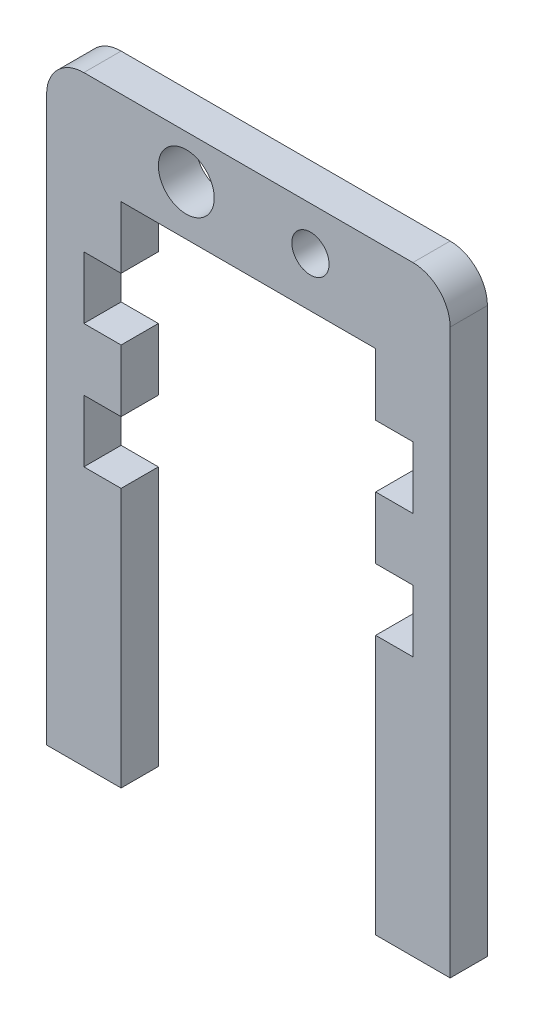
ISO-10303-21;
HEADER;
FILE_DESCRIPTION(('STEP AP214'),'2;1');
FILE_NAME('part.step','',(''),(''),'','','');
FILE_SCHEMA(('AUTOMOTIVE_DESIGN { 1 0 10303 214 1 1 1 1 }'));
ENDSEC;
DATA;
#1=APPLICATION_CONTEXT('core data for automotive mechanical design processes');
#2=APPLICATION_PROTOCOL_DEFINITION('international standard','automotive_design',2000,#1);
#3=PRODUCT_CONTEXT('',#1,'mechanical');
#4=PRODUCT('Part','Part','',(#3));
#5=PRODUCT_RELATED_PRODUCT_CATEGORY('part','',(#4));
#6=PRODUCT_DEFINITION_FORMATION('','',#4);
#7=PRODUCT_DEFINITION_CONTEXT('part definition',#1,'design');
#8=PRODUCT_DEFINITION('design','',#6,#7);
#9=PRODUCT_DEFINITION_SHAPE('','',#8);
#10=(LENGTH_UNIT() NAMED_UNIT(*) SI_UNIT(.MILLI.,.METRE.));
#11=(NAMED_UNIT(*) PLANE_ANGLE_UNIT() SI_UNIT($,.RADIAN.));
#12=(NAMED_UNIT(*) SI_UNIT($,.STERADIAN.) SOLID_ANGLE_UNIT());
#13=UNCERTAINTY_MEASURE_WITH_UNIT(LENGTH_MEASURE(1.E-05),#10,'distance_accuracy_value','');
#14=(GEOMETRIC_REPRESENTATION_CONTEXT(3) GLOBAL_UNCERTAINTY_ASSIGNED_CONTEXT((#13)) GLOBAL_UNIT_ASSIGNED_CONTEXT((#10,
#11,#12)) REPRESENTATION_CONTEXT('',''));
#15=CARTESIAN_POINT('',(0.,0.,0.));
#16=DIRECTION('',(0.,0.,1.));
#17=DIRECTION('',(1.,0.,0.));
#18=AXIS2_PLACEMENT_3D('',#15,#16,#17);
#19=CARTESIAN_POINT('',(-13.25,24.95,3.));
#20=DIRECTION('',(0.,0.,-1.));
#21=DIRECTION('',(-1.,0.,0.));
#22=AXIS2_PLACEMENT_3D('',#19,#20,#21);
#23=PLANE('',#22);
#24=DIRECTION('',(0.,-1.,0.));
#25=VECTOR('',#24,1.);
#26=CARTESIAN_POINT('',(-16.25,-24.95,3.));
#27=LINE('',#26,#25);
#28=CARTESIAN_POINT('',(-16.25,24.95,3.));
#29=VERTEX_POINT('',#28);
#30=CARTESIAN_POINT('',(-16.25,-20.45,3.));
#31=VERTEX_POINT('',#30);
#32=EDGE_CURVE('E81',#29,#31,#27,.T.);
#33=ORIENTED_EDGE('',*,*,#32,.T.);
#34=DIRECTION('',(-1.,0.,0.));
#35=VECTOR('',#34,1.);
#36=CARTESIAN_POINT('',(-16.25,-20.45,3.));
#37=LINE('',#36,#35);
#38=CARTESIAN_POINT('',(-10.25,-20.45,3.));
#39=VERTEX_POINT('',#38);
#40=EDGE_CURVE('E279',#39,#31,#37,.T.);
#41=ORIENTED_EDGE('',*,*,#40,.F.);
#42=DIRECTION('',(0.,-1.,0.));
#43=VECTOR('',#42,1.);
#44=CARTESIAN_POINT('',(-10.25,0.449999999999998,3.));
#45=LINE('',#44,#43);
#46=CARTESIAN_POINT('',(-10.25,0.449999999999998,3.));
#47=VERTEX_POINT('',#46);
#48=EDGE_CURVE('E339',#47,#39,#45,.T.);
#49=ORIENTED_EDGE('',*,*,#48,.F.);
#50=DIRECTION('',(1.,0.,0.));
#51=VECTOR('',#50,1.);
#52=CARTESIAN_POINT('',(-13.25,0.449999999999998,3.));
#53=LINE('',#52,#51);
#54=CARTESIAN_POINT('',(-13.25,0.449999999999998,3.));
#55=VERTEX_POINT('',#54);
#56=EDGE_CURVE('E337',#55,#47,#53,.T.);
#57=ORIENTED_EDGE('',*,*,#56,.F.);
#58=DIRECTION('',(0.,-1.,0.));
#59=VECTOR('',#58,1.);
#60=CARTESIAN_POINT('',(-13.25,5.45,3.));
#61=LINE('',#60,#59);
#62=CARTESIAN_POINT('',(-13.25,5.45,3.));
#63=VERTEX_POINT('',#62);
#64=EDGE_CURVE('E335',#63,#55,#61,.T.);
#65=ORIENTED_EDGE('',*,*,#64,.F.);
#66=DIRECTION('',(-1.,0.,0.));
#67=VECTOR('',#66,1.);
#68=CARTESIAN_POINT('',(-10.25,5.45,3.));
#69=LINE('',#68,#67);
#70=CARTESIAN_POINT('',(-10.25,5.45,3.));
#71=VERTEX_POINT('',#70);
#72=EDGE_CURVE('E333',#71,#63,#69,.T.);
#73=ORIENTED_EDGE('',*,*,#72,.F.);
#74=DIRECTION('',(0.,-1.,0.));
#75=VECTOR('',#74,1.);
#76=CARTESIAN_POINT('',(-10.25,10.45,3.));
#77=LINE('',#76,#75);
#78=CARTESIAN_POINT('',(-10.25,10.45,3.));
#79=VERTEX_POINT('',#78);
#80=EDGE_CURVE('E331',#79,#71,#77,.T.);
#81=ORIENTED_EDGE('',*,*,#80,.F.);
#82=DIRECTION('',(1.,0.,0.));
#83=VECTOR('',#82,1.);
#84=CARTESIAN_POINT('',(-13.25,10.45,3.));
#85=LINE('',#84,#83);
#86=CARTESIAN_POINT('',(-13.25,10.45,3.));
#87=VERTEX_POINT('',#86);
#88=EDGE_CURVE('E329',#87,#79,#85,.T.);
#89=ORIENTED_EDGE('',*,*,#88,.F.);
#90=DIRECTION('',(0.,-1.,0.));
#91=VECTOR('',#90,1.);
#92=CARTESIAN_POINT('',(-13.25,15.45,3.));
#93=LINE('',#92,#91);
#94=CARTESIAN_POINT('',(-13.25,15.45,3.));
#95=VERTEX_POINT('',#94);
#96=EDGE_CURVE('E327',#95,#87,#93,.T.);
#97=ORIENTED_EDGE('',*,*,#96,.F.);
#98=DIRECTION('',(-1.,0.,0.));
#99=VECTOR('',#98,1.);
#100=CARTESIAN_POINT('',(-10.25,15.45,3.));
#101=LINE('',#100,#99);
#102=CARTESIAN_POINT('',(-10.25,15.45,3.));
#103=VERTEX_POINT('',#102);
#104=EDGE_CURVE('E325',#103,#95,#101,.T.);
#105=ORIENTED_EDGE('',*,*,#104,.F.);
#106=DIRECTION('',(0.,-1.,0.));
#107=VECTOR('',#106,1.);
#108=CARTESIAN_POINT('',(-10.25,20.45,3.));
#109=LINE('',#108,#107);
#110=CARTESIAN_POINT('',(-10.25,20.45,3.));
#111=VERTEX_POINT('',#110);
#112=EDGE_CURVE('E323',#111,#103,#109,.T.);
#113=ORIENTED_EDGE('',*,*,#112,.F.);
#114=DIRECTION('',(-1.,0.,0.));
#115=VECTOR('',#114,1.);
#116=CARTESIAN_POINT('',(-10.25,20.45,3.));
#117=LINE('',#116,#115);
#118=CARTESIAN_POINT('',(10.25,20.45,3.));
#119=VERTEX_POINT('',#118);
#120=EDGE_CURVE('E321',#119,#111,#117,.T.);
#121=ORIENTED_EDGE('',*,*,#120,.F.);
#122=DIRECTION('',(0.,1.,0.));
#123=VECTOR('',#122,1.);
#124=CARTESIAN_POINT('',(10.25,20.45,3.));
#125=LINE('',#124,#123);
#126=CARTESIAN_POINT('',(10.25,15.45,3.));
#127=VERTEX_POINT('',#126);
#128=EDGE_CURVE('E319',#127,#119,#125,.T.);
#129=ORIENTED_EDGE('',*,*,#128,.F.);
#130=DIRECTION('',(-1.,0.,0.));
#131=VECTOR('',#130,1.);
#132=CARTESIAN_POINT('',(10.25,15.45,3.));
#133=LINE('',#132,#131);
#134=CARTESIAN_POINT('',(13.25,15.45,3.));
#135=VERTEX_POINT('',#134);
#136=EDGE_CURVE('E317',#135,#127,#133,.T.);
#137=ORIENTED_EDGE('',*,*,#136,.F.);
#138=DIRECTION('',(0.,1.,0.));
#139=VECTOR('',#138,1.);
#140=CARTESIAN_POINT('',(13.25,15.45,3.));
#141=LINE('',#140,#139);
#142=CARTESIAN_POINT('',(13.25,10.45,3.));
#143=VERTEX_POINT('',#142);
#144=EDGE_CURVE('E315',#143,#135,#141,.T.);
#145=ORIENTED_EDGE('',*,*,#144,.F.);
#146=DIRECTION('',(1.,0.,0.));
#147=VECTOR('',#146,1.);
#148=CARTESIAN_POINT('',(13.25,10.45,3.));
#149=LINE('',#148,#147);
#150=CARTESIAN_POINT('',(10.25,10.45,3.));
#151=VERTEX_POINT('',#150);
#152=EDGE_CURVE('E313',#151,#143,#149,.T.);
#153=ORIENTED_EDGE('',*,*,#152,.F.);
#154=DIRECTION('',(0.,1.,0.));
#155=VECTOR('',#154,1.);
#156=CARTESIAN_POINT('',(10.25,10.45,3.));
#157=LINE('',#156,#155);
#158=CARTESIAN_POINT('',(10.25,5.45,3.));
#159=VERTEX_POINT('',#158);
#160=EDGE_CURVE('E311',#159,#151,#157,.T.);
#161=ORIENTED_EDGE('',*,*,#160,.F.);
#162=DIRECTION('',(-1.,0.,0.));
#163=VECTOR('',#162,1.);
#164=CARTESIAN_POINT('',(10.25,5.45,3.));
#165=LINE('',#164,#163);
#166=CARTESIAN_POINT('',(13.25,5.45,3.));
#167=VERTEX_POINT('',#166);
#168=EDGE_CURVE('E309',#167,#159,#165,.T.);
#169=ORIENTED_EDGE('',*,*,#168,.F.);
#170=DIRECTION('',(0.,1.,0.));
#171=VECTOR('',#170,1.);
#172=CARTESIAN_POINT('',(13.25,5.45,3.));
#173=LINE('',#172,#171);
#174=CARTESIAN_POINT('',(13.25,0.450000000000001,3.));
#175=VERTEX_POINT('',#174);
#176=EDGE_CURVE('E307',#175,#167,#173,.T.);
#177=ORIENTED_EDGE('',*,*,#176,.F.);
#178=DIRECTION('',(1.,0.,0.));
#179=VECTOR('',#178,1.);
#180=CARTESIAN_POINT('',(13.25,0.450000000000001,3.));
#181=LINE('',#180,#179);
#182=CARTESIAN_POINT('',(10.25,0.45,3.));
#183=VERTEX_POINT('',#182);
#184=EDGE_CURVE('E305',#183,#175,#181,.T.);
#185=ORIENTED_EDGE('',*,*,#184,.F.);
#186=DIRECTION('',(0.,1.,0.));
#187=VECTOR('',#186,1.);
#188=CARTESIAN_POINT('',(10.25,0.45,3.));
#189=LINE('',#188,#187);
#190=CARTESIAN_POINT('',(10.25,-20.45,3.));
#191=VERTEX_POINT('',#190);
#192=EDGE_CURVE('E303',#191,#183,#189,.T.);
#193=ORIENTED_EDGE('',*,*,#192,.F.);
#194=CARTESIAN_POINT('',(16.25,-20.45,3.));
#195=VERTEX_POINT('',#194);
#196=EDGE_CURVE('E237',#195,#191,#37,.T.);
#197=ORIENTED_EDGE('',*,*,#196,.F.);
#198=DIRECTION('',(0.,1.,0.));
#199=VECTOR('',#198,1.);
#200=CARTESIAN_POINT('',(16.25,24.95,3.));
#201=LINE('',#200,#199);
#202=CARTESIAN_POINT('',(16.25,24.95,3.));
#203=VERTEX_POINT('',#202);
#204=EDGE_CURVE('E235',#195,#203,#201,.T.);
#205=ORIENTED_EDGE('',*,*,#204,.T.);
#206=CARTESIAN_POINT('',(13.25,24.95,3.));
#207=DIRECTION('',(0.,0.,1.));
#208=DIRECTION('',(-1.,0.,0.));
#209=AXIS2_PLACEMENT_3D('',#206,#207,#208);
#210=CIRCLE('',#209,3.);
#211=CARTESIAN_POINT('',(13.25,27.95,3.));
#212=VERTEX_POINT('',#211);
#213=EDGE_CURVE('E257',#203,#212,#210,.T.);
#214=ORIENTED_EDGE('',*,*,#213,.T.);
#215=DIRECTION('',(-1.,0.,0.));
#216=VECTOR('',#215,1.);
#217=CARTESIAN_POINT('',(-13.25,27.95,3.));
#218=LINE('',#217,#216);
#219=CARTESIAN_POINT('',(-13.25,27.95,3.));
#220=VERTEX_POINT('',#219);
#221=EDGE_CURVE('E50',#212,#220,#218,.T.);
#222=ORIENTED_EDGE('',*,*,#221,.T.);
#223=CARTESIAN_POINT('',(-13.25,24.95,3.));
#224=DIRECTION('',(0.,0.,1.));
#225=DIRECTION('',(-1.,0.,0.));
#226=AXIS2_PLACEMENT_3D('',#223,#224,#225);
#227=CIRCLE('',#226,3.);
#228=EDGE_CURVE('E251',#220,#29,#227,.T.);
#229=ORIENTED_EDGE('',*,*,#228,.T.);
#230=EDGE_LOOP('',(#33,#41,#49,#57,#65,#73,#81,#89,#97,#105,#113,#121,#129,#137,#145,#153,#161,
#169,#177,#185,#193,#197,#205,#214,#222,#229));
#231=FACE_BOUND('',#230,.T.);
#232=CARTESIAN_POINT('',(-5.,24.45,3.));
#233=DIRECTION('',(0.,0.,1.));
#234=DIRECTION('',(1.,0.,0.));
#235=AXIS2_PLACEMENT_3D('',#232,#233,#234);
#236=CIRCLE('',#235,2.25);
#237=CARTESIAN_POINT('',(-2.75,24.45,3.));
#238=VERTEX_POINT('',#237);
#239=EDGE_CURVE('E297',#238,#238,#236,.T.);
#240=ORIENTED_EDGE('',*,*,#239,.F.);
#241=EDGE_LOOP('',(#240));
#242=FACE_BOUND('',#241,.T.);
#243=CARTESIAN_POINT('',(5.,24.45,3.));
#244=DIRECTION('',(0.,0.,1.));
#245=DIRECTION('',(1.,0.,0.));
#246=AXIS2_PLACEMENT_3D('',#243,#244,#245);
#247=CIRCLE('',#246,1.5);
#248=CARTESIAN_POINT('',(6.5,24.45,3.));
#249=VERTEX_POINT('',#248);
#250=EDGE_CURVE('E291',#249,#249,#247,.T.);
#251=ORIENTED_EDGE('',*,*,#250,.F.);
#252=EDGE_LOOP('',(#251));
#253=FACE_BOUND('',#252,.T.);
#254=ADVANCED_FACE('F33',(#231,#242,#253),#23,.F.);
#255=CARTESIAN_POINT('',(-13.25,24.95,0.));
#256=DIRECTION('',(0.,0.,-1.));
#257=DIRECTION('',(-1.,0.,0.));
#258=AXIS2_PLACEMENT_3D('',#255,#256,#257);
#259=PLANE('',#258);
#260=DIRECTION('',(-1.,0.,0.));
#261=VECTOR('',#260,1.);
#262=CARTESIAN_POINT('',(-16.25,-20.45,0.));
#263=LINE('',#262,#261);
#264=CARTESIAN_POINT('',(-10.25,-20.45,0.));
#265=VERTEX_POINT('',#264);
#266=CARTESIAN_POINT('',(-16.25,-20.45,0.));
#267=VERTEX_POINT('',#266);
#268=EDGE_CURVE('E228',#265,#267,#263,.T.);
#269=ORIENTED_EDGE('',*,*,#268,.T.);
#270=DIRECTION('',(0.,-1.,0.));
#271=VECTOR('',#270,1.);
#272=CARTESIAN_POINT('',(-16.25,-24.95,0.));
#273=LINE('',#272,#271);
#274=CARTESIAN_POINT('',(-16.25,24.95,0.));
#275=VERTEX_POINT('',#274);
#276=EDGE_CURVE('E242',#275,#267,#273,.T.);
#277=ORIENTED_EDGE('',*,*,#276,.F.);
#278=CARTESIAN_POINT('',(-13.25,24.95,0.));
#279=DIRECTION('',(0.,0.,1.));
#280=DIRECTION('',(-1.,0.,0.));
#281=AXIS2_PLACEMENT_3D('',#278,#279,#280);
#282=CIRCLE('',#281,3.);
#283=CARTESIAN_POINT('',(-13.25,27.95,0.));
#284=VERTEX_POINT('',#283);
#285=EDGE_CURVE('E246',#284,#275,#282,.T.);
#286=ORIENTED_EDGE('',*,*,#285,.F.);
#287=DIRECTION('',(-1.,0.,0.));
#288=VECTOR('',#287,1.);
#289=CARTESIAN_POINT('',(-13.25,27.95,0.));
#290=LINE('',#289,#288);
#291=CARTESIAN_POINT('',(13.25,27.95,0.));
#292=VERTEX_POINT('',#291);
#293=EDGE_CURVE('E74',#292,#284,#290,.T.);
#294=ORIENTED_EDGE('',*,*,#293,.F.);
#295=CARTESIAN_POINT('',(13.25,24.95,0.));
#296=DIRECTION('',(0.,0.,1.));
#297=DIRECTION('',(-1.,0.,0.));
#298=AXIS2_PLACEMENT_3D('',#295,#296,#297);
#299=CIRCLE('',#298,3.);
#300=CARTESIAN_POINT('',(16.25,24.95,0.));
#301=VERTEX_POINT('',#300);
#302=EDGE_CURVE('E68',#301,#292,#299,.T.);
#303=ORIENTED_EDGE('',*,*,#302,.F.);
#304=DIRECTION('',(0.,1.,0.));
#305=VECTOR('',#304,1.);
#306=CARTESIAN_POINT('',(16.25,24.95,0.));
#307=LINE('',#306,#305);
#308=CARTESIAN_POINT('',(16.25,-20.45,0.));
#309=VERTEX_POINT('',#308);
#310=EDGE_CURVE('E234',#309,#301,#307,.T.);
#311=ORIENTED_EDGE('',*,*,#310,.F.);
#312=CARTESIAN_POINT('',(10.25,-20.45,0.));
#313=VERTEX_POINT('',#312);
#314=EDGE_CURVE('E216',#309,#313,#263,.T.);
#315=ORIENTED_EDGE('',*,*,#314,.T.);
#316=DIRECTION('',(0.,1.,0.));
#317=VECTOR('',#316,1.);
#318=CARTESIAN_POINT('',(10.25,0.45,0.));
#319=LINE('',#318,#317);
#320=CARTESIAN_POINT('',(10.25,0.45,0.));
#321=VERTEX_POINT('',#320);
#322=EDGE_CURVE('E300',#313,#321,#319,.T.);
#323=ORIENTED_EDGE('',*,*,#322,.T.);
#324=DIRECTION('',(1.,0.,0.));
#325=VECTOR('',#324,1.);
#326=CARTESIAN_POINT('',(13.25,0.450000000000001,0.));
#327=LINE('',#326,#325);
#328=CARTESIAN_POINT('',(13.25,0.450000000000001,0.));
#329=VERTEX_POINT('',#328);
#330=EDGE_CURVE('E342',#321,#329,#327,.T.);
#331=ORIENTED_EDGE('',*,*,#330,.T.);
#332=DIRECTION('',(0.,1.,0.));
#333=VECTOR('',#332,1.);
#334=CARTESIAN_POINT('',(13.25,5.45,0.));
#335=LINE('',#334,#333);
#336=CARTESIAN_POINT('',(13.25,5.45,0.));
#337=VERTEX_POINT('',#336);
#338=EDGE_CURVE('E345',#329,#337,#335,.T.);
#339=ORIENTED_EDGE('',*,*,#338,.T.);
#340=DIRECTION('',(-1.,0.,0.));
#341=VECTOR('',#340,1.);
#342=CARTESIAN_POINT('',(10.25,5.45,0.));
#343=LINE('',#342,#341);
#344=CARTESIAN_POINT('',(10.25,5.45,0.));
#345=VERTEX_POINT('',#344);
#346=EDGE_CURVE('E348',#337,#345,#343,.T.);
#347=ORIENTED_EDGE('',*,*,#346,.T.);
#348=DIRECTION('',(0.,1.,0.));
#349=VECTOR('',#348,1.);
#350=CARTESIAN_POINT('',(10.25,10.45,0.));
#351=LINE('',#350,#349);
#352=CARTESIAN_POINT('',(10.25,10.45,0.));
#353=VERTEX_POINT('',#352);
#354=EDGE_CURVE('E351',#345,#353,#351,.T.);
#355=ORIENTED_EDGE('',*,*,#354,.T.);
#356=DIRECTION('',(1.,0.,0.));
#357=VECTOR('',#356,1.);
#358=CARTESIAN_POINT('',(13.25,10.45,0.));
#359=LINE('',#358,#357);
#360=CARTESIAN_POINT('',(13.25,10.45,0.));
#361=VERTEX_POINT('',#360);
#362=EDGE_CURVE('E354',#353,#361,#359,.T.);
#363=ORIENTED_EDGE('',*,*,#362,.T.);
#364=DIRECTION('',(0.,1.,0.));
#365=VECTOR('',#364,1.);
#366=CARTESIAN_POINT('',(13.25,15.45,0.));
#367=LINE('',#366,#365);
#368=CARTESIAN_POINT('',(13.25,15.45,0.));
#369=VERTEX_POINT('',#368);
#370=EDGE_CURVE('E357',#361,#369,#367,.T.);
#371=ORIENTED_EDGE('',*,*,#370,.T.);
#372=DIRECTION('',(-1.,0.,0.));
#373=VECTOR('',#372,1.);
#374=CARTESIAN_POINT('',(10.25,15.45,0.));
#375=LINE('',#374,#373);
#376=CARTESIAN_POINT('',(10.25,15.45,0.));
#377=VERTEX_POINT('',#376);
#378=EDGE_CURVE('E360',#369,#377,#375,.T.);
#379=ORIENTED_EDGE('',*,*,#378,.T.);
#380=DIRECTION('',(0.,1.,0.));
#381=VECTOR('',#380,1.);
#382=CARTESIAN_POINT('',(10.25,20.45,0.));
#383=LINE('',#382,#381);
#384=CARTESIAN_POINT('',(10.25,20.45,0.));
#385=VERTEX_POINT('',#384);
#386=EDGE_CURVE('E363',#377,#385,#383,.T.);
#387=ORIENTED_EDGE('',*,*,#386,.T.);
#388=DIRECTION('',(-1.,0.,0.));
#389=VECTOR('',#388,1.);
#390=CARTESIAN_POINT('',(-10.25,20.45,0.));
#391=LINE('',#390,#389);
#392=CARTESIAN_POINT('',(-10.25,20.45,0.));
#393=VERTEX_POINT('',#392);
#394=EDGE_CURVE('E366',#385,#393,#391,.T.);
#395=ORIENTED_EDGE('',*,*,#394,.T.);
#396=DIRECTION('',(0.,-1.,0.));
#397=VECTOR('',#396,1.);
#398=CARTESIAN_POINT('',(-10.25,20.45,0.));
#399=LINE('',#398,#397);
#400=CARTESIAN_POINT('',(-10.25,15.45,0.));
#401=VERTEX_POINT('',#400);
#402=EDGE_CURVE('E369',#393,#401,#399,.T.);
#403=ORIENTED_EDGE('',*,*,#402,.T.);
#404=DIRECTION('',(-1.,0.,0.));
#405=VECTOR('',#404,1.);
#406=CARTESIAN_POINT('',(-10.25,15.45,0.));
#407=LINE('',#406,#405);
#408=CARTESIAN_POINT('',(-13.25,15.45,0.));
#409=VERTEX_POINT('',#408);
#410=EDGE_CURVE('E372',#401,#409,#407,.T.);
#411=ORIENTED_EDGE('',*,*,#410,.T.);
#412=DIRECTION('',(0.,-1.,0.));
#413=VECTOR('',#412,1.);
#414=CARTESIAN_POINT('',(-13.25,15.45,0.));
#415=LINE('',#414,#413);
#416=CARTESIAN_POINT('',(-13.25,10.45,0.));
#417=VERTEX_POINT('',#416);
#418=EDGE_CURVE('E375',#409,#417,#415,.T.);
#419=ORIENTED_EDGE('',*,*,#418,.T.);
#420=DIRECTION('',(1.,0.,0.));
#421=VECTOR('',#420,1.);
#422=CARTESIAN_POINT('',(-13.25,10.45,0.));
#423=LINE('',#422,#421);
#424=CARTESIAN_POINT('',(-10.25,10.45,0.));
#425=VERTEX_POINT('',#424);
#426=EDGE_CURVE('E378',#417,#425,#423,.T.);
#427=ORIENTED_EDGE('',*,*,#426,.T.);
#428=DIRECTION('',(0.,-1.,0.));
#429=VECTOR('',#428,1.);
#430=CARTESIAN_POINT('',(-10.25,10.45,0.));
#431=LINE('',#430,#429);
#432=CARTESIAN_POINT('',(-10.25,5.45,0.));
#433=VERTEX_POINT('',#432);
#434=EDGE_CURVE('E381',#425,#433,#431,.T.);
#435=ORIENTED_EDGE('',*,*,#434,.T.);
#436=DIRECTION('',(-1.,0.,0.));
#437=VECTOR('',#436,1.);
#438=CARTESIAN_POINT('',(-10.25,5.45,0.));
#439=LINE('',#438,#437);
#440=CARTESIAN_POINT('',(-13.25,5.45,0.));
#441=VERTEX_POINT('',#440);
#442=EDGE_CURVE('E384',#433,#441,#439,.T.);
#443=ORIENTED_EDGE('',*,*,#442,.T.);
#444=DIRECTION('',(0.,-1.,0.));
#445=VECTOR('',#444,1.);
#446=CARTESIAN_POINT('',(-13.25,5.45,0.));
#447=LINE('',#446,#445);
#448=CARTESIAN_POINT('',(-13.25,0.449999999999998,0.));
#449=VERTEX_POINT('',#448);
#450=EDGE_CURVE('E387',#441,#449,#447,.T.);
#451=ORIENTED_EDGE('',*,*,#450,.T.);
#452=DIRECTION('',(1.,0.,0.));
#453=VECTOR('',#452,1.);
#454=CARTESIAN_POINT('',(-13.25,0.449999999999998,0.));
#455=LINE('',#454,#453);
#456=CARTESIAN_POINT('',(-10.25,0.449999999999998,0.));
#457=VERTEX_POINT('',#456);
#458=EDGE_CURVE('E390',#449,#457,#455,.T.);
#459=ORIENTED_EDGE('',*,*,#458,.T.);
#460=DIRECTION('',(0.,-1.,0.));
#461=VECTOR('',#460,1.);
#462=CARTESIAN_POINT('',(-10.25,0.449999999999998,0.));
#463=LINE('',#462,#461);
#464=EDGE_CURVE('E286',#457,#265,#463,.T.);
#465=ORIENTED_EDGE('',*,*,#464,.T.);
#466=EDGE_LOOP('',(#269,#277,#286,#294,#303,#311,#315,#323,#331,#339,#347,#355,#363,#371,#379,
#387,#395,#403,#411,#419,#427,#435,#443,#451,#459,#465));
#467=FACE_BOUND('',#466,.T.);
#468=CARTESIAN_POINT('',(-5.,24.45,0.));
#469=DIRECTION('',(0.,0.,1.));
#470=DIRECTION('',(1.,0.,0.));
#471=AXIS2_PLACEMENT_3D('',#468,#469,#470);
#472=CIRCLE('',#471,2.25);
#473=CARTESIAN_POINT('',(-2.75,24.45,0.));
#474=VERTEX_POINT('',#473);
#475=EDGE_CURVE('E294',#474,#474,#472,.T.);
#476=ORIENTED_EDGE('',*,*,#475,.T.);
#477=EDGE_LOOP('',(#476));
#478=FACE_BOUND('',#477,.T.);
#479=CARTESIAN_POINT('',(5.,24.45,0.));
#480=DIRECTION('',(0.,0.,1.));
#481=DIRECTION('',(1.,0.,0.));
#482=AXIS2_PLACEMENT_3D('',#479,#480,#481);
#483=CIRCLE('',#482,1.5);
#484=CARTESIAN_POINT('',(6.5,24.45,0.));
#485=VERTEX_POINT('',#484);
#486=EDGE_CURVE('E227',#485,#485,#483,.T.);
#487=ORIENTED_EDGE('',*,*,#486,.T.);
#488=EDGE_LOOP('',(#487));
#489=FACE_BOUND('',#488,.T.);
#490=ADVANCED_FACE('F240',(#467,#478,#489),#259,.T.);
#491=CARTESIAN_POINT('',(-13.25,24.95,3.));
#492=DIRECTION('',(0.,0.,-1.));
#493=DIRECTION('',(-1.,0.,0.));
#494=AXIS2_PLACEMENT_3D('',#491,#492,#493);
#495=CYLINDRICAL_SURFACE('',#494,3.);
#496=ORIENTED_EDGE('',*,*,#285,.T.);
#497=DIRECTION('',(0.,0.,-1.));
#498=VECTOR('',#497,1.);
#499=CARTESIAN_POINT('',(-16.25,24.95,3.));
#500=LINE('',#499,#498);
#501=EDGE_CURVE('E11',#29,#275,#500,.T.);
#502=ORIENTED_EDGE('',*,*,#501,.F.);
#503=ORIENTED_EDGE('',*,*,#228,.F.);
#504=DIRECTION('',(0.,0.,-1.));
#505=VECTOR('',#504,1.);
#506=CARTESIAN_POINT('',(-13.25,27.95,3.));
#507=LINE('',#506,#505);
#508=EDGE_CURVE('E252',#220,#284,#507,.T.);
#509=ORIENTED_EDGE('',*,*,#508,.T.);
#510=EDGE_LOOP('',(#496,#502,#503,#509));
#511=FACE_BOUND('',#510,.T.);
#512=ADVANCED_FACE('F35',(#511),#495,.T.);
#513=CARTESIAN_POINT('',(-16.25,-24.95,3.));
#514=DIRECTION('',(1.,0.,0.));
#515=DIRECTION('',(0.,1.,0.));
#516=AXIS2_PLACEMENT_3D('',#513,#514,#515);
#517=PLANE('',#516);
#518=ORIENTED_EDGE('',*,*,#276,.T.);
#519=DIRECTION('',(0.,0.,1.));
#520=VECTOR('',#519,1.);
#521=CARTESIAN_POINT('',(-16.25,-20.45,-0.00100000000000013));
#522=LINE('',#521,#520);
#523=EDGE_CURVE('E236',#267,#31,#522,.T.);
#524=ORIENTED_EDGE('',*,*,#523,.T.);
#525=ORIENTED_EDGE('',*,*,#32,.F.);
#526=ORIENTED_EDGE('',*,*,#501,.T.);
#527=EDGE_LOOP('',(#518,#524,#525,#526));
#528=FACE_BOUND('',#527,.T.);
#529=ADVANCED_FACE('F282',(#528),#517,.F.);
#530=CARTESIAN_POINT('',(16.25,24.95,3.));
#531=DIRECTION('',(-1.,0.,0.));
#532=DIRECTION('',(0.,-1.,0.));
#533=AXIS2_PLACEMENT_3D('',#530,#531,#532);
#534=PLANE('',#533);
#535=ORIENTED_EDGE('',*,*,#204,.F.);
#536=DIRECTION('',(0.,0.,1.));
#537=VECTOR('',#536,1.);
#538=CARTESIAN_POINT('',(16.25,-20.45,-0.00100000000000013));
#539=LINE('',#538,#537);
#540=EDGE_CURVE('E219',#309,#195,#539,.T.);
#541=ORIENTED_EDGE('',*,*,#540,.F.);
#542=ORIENTED_EDGE('',*,*,#310,.T.);
#543=DIRECTION('',(0.,0.,-1.));
#544=VECTOR('',#543,1.);
#545=CARTESIAN_POINT('',(16.25,24.95,3.));
#546=LINE('',#545,#544);
#547=EDGE_CURVE('E42',#203,#301,#546,.T.);
#548=ORIENTED_EDGE('',*,*,#547,.F.);
#549=EDGE_LOOP('',(#535,#541,#542,#548));
#550=FACE_BOUND('',#549,.T.);
#551=ADVANCED_FACE('F232',(#550),#534,.F.);
#552=CARTESIAN_POINT('',(13.25,24.95,3.));
#553=DIRECTION('',(0.,0.,-1.));
#554=DIRECTION('',(-1.,0.,0.));
#555=AXIS2_PLACEMENT_3D('',#552,#553,#554);
#556=CYLINDRICAL_SURFACE('',#555,3.);
#557=ORIENTED_EDGE('',*,*,#302,.T.);
#558=DIRECTION('',(0.,0.,-1.));
#559=VECTOR('',#558,1.);
#560=CARTESIAN_POINT('',(13.25,27.95,3.));
#561=LINE('',#560,#559);
#562=EDGE_CURVE('E254',#212,#292,#561,.T.);
#563=ORIENTED_EDGE('',*,*,#562,.F.);
#564=ORIENTED_EDGE('',*,*,#213,.F.);
#565=ORIENTED_EDGE('',*,*,#547,.T.);
#566=EDGE_LOOP('',(#557,#563,#564,#565));
#567=FACE_BOUND('',#566,.T.);
#568=ADVANCED_FACE('F256',(#567),#556,.T.);
#569=CARTESIAN_POINT('',(-13.25,27.95,3.));
#570=DIRECTION('',(0.,-1.,0.));
#571=DIRECTION('',(1.,0.,0.));
#572=AXIS2_PLACEMENT_3D('',#569,#570,#571);
#573=PLANE('',#572);
#574=ORIENTED_EDGE('',*,*,#293,.T.);
#575=ORIENTED_EDGE('',*,*,#508,.F.);
#576=ORIENTED_EDGE('',*,*,#221,.F.);
#577=ORIENTED_EDGE('',*,*,#562,.T.);
#578=EDGE_LOOP('',(#574,#575,#576,#577));
#579=FACE_BOUND('',#578,.T.);
#580=ADVANCED_FACE('F516',(#579),#573,.F.);
#581=CARTESIAN_POINT('',(10.25,0.45,3.));
#582=DIRECTION('',(-1.,0.,0.));
#583=DIRECTION('',(0.,-1.,0.));
#584=AXIS2_PLACEMENT_3D('',#581,#582,#583);
#585=PLANE('',#584);
#586=ORIENTED_EDGE('',*,*,#322,.F.);
#587=DIRECTION('',(0.,0.,-1.));
#588=VECTOR('',#587,1.);
#589=CARTESIAN_POINT('',(10.25,-20.45,3.));
#590=LINE('',#589,#588);
#591=EDGE_CURVE('E222',#191,#313,#590,.T.);
#592=ORIENTED_EDGE('',*,*,#591,.F.);
#593=ORIENTED_EDGE('',*,*,#192,.T.);
#594=DIRECTION('',(0.,0.,-1.));
#595=VECTOR('',#594,1.);
#596=CARTESIAN_POINT('',(10.25,0.45,3.));
#597=LINE('',#596,#595);
#598=EDGE_CURVE('E263',#183,#321,#597,.T.);
#599=ORIENTED_EDGE('',*,*,#598,.T.);
#600=EDGE_LOOP('',(#586,#592,#593,#599));
#601=FACE_BOUND('',#600,.T.);
#602=ADVANCED_FACE('F514',(#601),#585,.T.);
#603=CARTESIAN_POINT('',(13.25,0.450000000000001,3.));
#604=DIRECTION('',(0.,1.,0.));
#605=DIRECTION('',(-1.,0.,0.));
#606=AXIS2_PLACEMENT_3D('',#603,#604,#605);
#607=PLANE('',#606);
#608=ORIENTED_EDGE('',*,*,#330,.F.);
#609=ORIENTED_EDGE('',*,*,#598,.F.);
#610=ORIENTED_EDGE('',*,*,#184,.T.);
#611=DIRECTION('',(0.,0.,-1.));
#612=VECTOR('',#611,1.);
#613=CARTESIAN_POINT('',(13.25,0.450000000000001,3.));
#614=LINE('',#613,#612);
#615=EDGE_CURVE('E268',#175,#329,#614,.T.);
#616=ORIENTED_EDGE('',*,*,#615,.T.);
#617=EDGE_LOOP('',(#608,#609,#610,#616));
#618=FACE_BOUND('',#617,.T.);
#619=ADVANCED_FACE('F438',(#618),#607,.T.);
#620=CARTESIAN_POINT('',(13.25,5.45,3.));
#621=DIRECTION('',(-1.,0.,0.));
#622=DIRECTION('',(0.,0.,1.));
#623=AXIS2_PLACEMENT_3D('',#620,#621,#622);
#624=PLANE('',#623);
#625=ORIENTED_EDGE('',*,*,#338,.F.);
#626=ORIENTED_EDGE('',*,*,#615,.F.);
#627=ORIENTED_EDGE('',*,*,#176,.T.);
#628=DIRECTION('',(0.,0.,-1.));
#629=VECTOR('',#628,1.);
#630=CARTESIAN_POINT('',(13.25,5.45,3.));
#631=LINE('',#630,#629);
#632=EDGE_CURVE('E272',#167,#337,#631,.T.);
#633=ORIENTED_EDGE('',*,*,#632,.T.);
#634=EDGE_LOOP('',(#625,#626,#627,#633));
#635=FACE_BOUND('',#634,.T.);
#636=ADVANCED_FACE('F429',(#635),#624,.T.);
#637=CARTESIAN_POINT('',(10.25,5.45,3.));
#638=DIRECTION('',(0.,-1.,0.));
#639=DIRECTION('',(0.,0.,-1.));
#640=AXIS2_PLACEMENT_3D('',#637,#638,#639);
#641=PLANE('',#640);
#642=ORIENTED_EDGE('',*,*,#346,.F.);
#643=ORIENTED_EDGE('',*,*,#632,.F.);
#644=ORIENTED_EDGE('',*,*,#168,.T.);
#645=DIRECTION('',(0.,0.,-1.));
#646=VECTOR('',#645,1.);
#647=CARTESIAN_POINT('',(10.25,5.45,3.));
#648=LINE('',#647,#646);
#649=EDGE_CURVE('E424',#159,#345,#648,.T.);
#650=ORIENTED_EDGE('',*,*,#649,.T.);
#651=EDGE_LOOP('',(#642,#643,#644,#650));
#652=FACE_BOUND('',#651,.T.);
#653=ADVANCED_FACE('F434',(#652),#641,.T.);
#654=CARTESIAN_POINT('',(10.25,10.45,3.));
#655=DIRECTION('',(-1.,0.,0.));
#656=DIRECTION('',(0.,0.,1.));
#657=AXIS2_PLACEMENT_3D('',#654,#655,#656);
#658=PLANE('',#657);
#659=ORIENTED_EDGE('',*,*,#354,.F.);
#660=ORIENTED_EDGE('',*,*,#649,.F.);
#661=ORIENTED_EDGE('',*,*,#160,.T.);
#662=DIRECTION('',(0.,0.,-1.));
#663=VECTOR('',#662,1.);
#664=CARTESIAN_POINT('',(10.25,10.45,3.));
#665=LINE('',#664,#663);
#666=EDGE_CURVE('E422',#151,#353,#665,.T.);
#667=ORIENTED_EDGE('',*,*,#666,.T.);
#668=EDGE_LOOP('',(#659,#660,#661,#667));
#669=FACE_BOUND('',#668,.T.);
#670=ADVANCED_FACE('F444',(#669),#658,.T.);
#671=CARTESIAN_POINT('',(13.25,10.45,3.));
#672=DIRECTION('',(0.,1.,0.));
#673=DIRECTION('',(0.,0.,1.));
#674=AXIS2_PLACEMENT_3D('',#671,#672,#673);
#675=PLANE('',#674);
#676=ORIENTED_EDGE('',*,*,#362,.F.);
#677=ORIENTED_EDGE('',*,*,#666,.F.);
#678=ORIENTED_EDGE('',*,*,#152,.T.);
#679=DIRECTION('',(0.,0.,-1.));
#680=VECTOR('',#679,1.);
#681=CARTESIAN_POINT('',(13.25,10.45,3.));
#682=LINE('',#681,#680);
#683=EDGE_CURVE('E420',#143,#361,#682,.T.);
#684=ORIENTED_EDGE('',*,*,#683,.T.);
#685=EDGE_LOOP('',(#676,#677,#678,#684));
#686=FACE_BOUND('',#685,.T.);
#687=ADVANCED_FACE('F449',(#686),#675,.T.);
#688=CARTESIAN_POINT('',(13.25,15.45,3.));
#689=DIRECTION('',(-1.,0.,0.));
#690=DIRECTION('',(0.,0.,1.));
#691=AXIS2_PLACEMENT_3D('',#688,#689,#690);
#692=PLANE('',#691);
#693=ORIENTED_EDGE('',*,*,#370,.F.);
#694=ORIENTED_EDGE('',*,*,#683,.F.);
#695=ORIENTED_EDGE('',*,*,#144,.T.);
#696=DIRECTION('',(0.,0.,-1.));
#697=VECTOR('',#696,1.);
#698=CARTESIAN_POINT('',(13.25,15.45,3.));
#699=LINE('',#698,#697);
#700=EDGE_CURVE('E418',#135,#369,#699,.T.);
#701=ORIENTED_EDGE('',*,*,#700,.T.);
#702=EDGE_LOOP('',(#693,#694,#695,#701));
#703=FACE_BOUND('',#702,.T.);
#704=ADVANCED_FACE('F453',(#703),#692,.T.);
#705=CARTESIAN_POINT('',(10.25,15.45,3.));
#706=DIRECTION('',(0.,-1.,0.));
#707=DIRECTION('',(1.,0.,0.));
#708=AXIS2_PLACEMENT_3D('',#705,#706,#707);
#709=PLANE('',#708);
#710=ORIENTED_EDGE('',*,*,#378,.F.);
#711=ORIENTED_EDGE('',*,*,#700,.F.);
#712=ORIENTED_EDGE('',*,*,#136,.T.);
#713=DIRECTION('',(0.,0.,-1.));
#714=VECTOR('',#713,1.);
#715=CARTESIAN_POINT('',(10.25,15.45,3.));
#716=LINE('',#715,#714);
#717=EDGE_CURVE('E416',#127,#377,#716,.T.);
#718=ORIENTED_EDGE('',*,*,#717,.T.);
#719=EDGE_LOOP('',(#710,#711,#712,#718));
#720=FACE_BOUND('',#719,.T.);
#721=ADVANCED_FACE('F458',(#720),#709,.T.);
#722=CARTESIAN_POINT('',(10.25,20.45,3.));
#723=DIRECTION('',(-1.,0.,0.));
#724=DIRECTION('',(0.,-1.,0.));
#725=AXIS2_PLACEMENT_3D('',#722,#723,#724);
#726=PLANE('',#725);
#727=ORIENTED_EDGE('',*,*,#386,.F.);
#728=ORIENTED_EDGE('',*,*,#717,.F.);
#729=ORIENTED_EDGE('',*,*,#128,.T.);
#730=DIRECTION('',(0.,0.,-1.));
#731=VECTOR('',#730,1.);
#732=CARTESIAN_POINT('',(10.25,20.45,3.));
#733=LINE('',#732,#731);
#734=EDGE_CURVE('E414',#119,#385,#733,.T.);
#735=ORIENTED_EDGE('',*,*,#734,.T.);
#736=EDGE_LOOP('',(#727,#728,#729,#735));
#737=FACE_BOUND('',#736,.T.);
#738=ADVANCED_FACE('F463',(#737),#726,.T.);
#739=CARTESIAN_POINT('',(-10.25,20.45,3.));
#740=DIRECTION('',(0.,-1.,0.));
#741=DIRECTION('',(0.,0.,-1.));
#742=AXIS2_PLACEMENT_3D('',#739,#740,#741);
#743=PLANE('',#742);
#744=ORIENTED_EDGE('',*,*,#394,.F.);
#745=ORIENTED_EDGE('',*,*,#734,.F.);
#746=ORIENTED_EDGE('',*,*,#120,.T.);
#747=DIRECTION('',(0.,0.,-1.));
#748=VECTOR('',#747,1.);
#749=CARTESIAN_POINT('',(-10.25,20.45,3.));
#750=LINE('',#749,#748);
#751=EDGE_CURVE('E412',#111,#393,#750,.T.);
#752=ORIENTED_EDGE('',*,*,#751,.T.);
#753=EDGE_LOOP('',(#744,#745,#746,#752));
#754=FACE_BOUND('',#753,.T.);
#755=ADVANCED_FACE('F468',(#754),#743,.T.);
#756=CARTESIAN_POINT('',(-10.25,20.45,3.));
#757=DIRECTION('',(1.,0.,0.));
#758=DIRECTION('',(0.,1.,0.));
#759=AXIS2_PLACEMENT_3D('',#756,#757,#758);
#760=PLANE('',#759);
#761=ORIENTED_EDGE('',*,*,#402,.F.);
#762=ORIENTED_EDGE('',*,*,#751,.F.);
#763=ORIENTED_EDGE('',*,*,#112,.T.);
#764=DIRECTION('',(0.,0.,-1.));
#765=VECTOR('',#764,1.);
#766=CARTESIAN_POINT('',(-10.25,15.45,3.));
#767=LINE('',#766,#765);
#768=EDGE_CURVE('E410',#103,#401,#767,.T.);
#769=ORIENTED_EDGE('',*,*,#768,.T.);
#770=EDGE_LOOP('',(#761,#762,#763,#769));
#771=FACE_BOUND('',#770,.T.);
#772=ADVANCED_FACE('F473',(#771),#760,.T.);
#773=CARTESIAN_POINT('',(-10.25,15.45,3.));
#774=DIRECTION('',(0.,-1.,0.));
#775=DIRECTION('',(1.,0.,0.));
#776=AXIS2_PLACEMENT_3D('',#773,#774,#775);
#777=PLANE('',#776);
#778=ORIENTED_EDGE('',*,*,#410,.F.);
#779=ORIENTED_EDGE('',*,*,#768,.F.);
#780=ORIENTED_EDGE('',*,*,#104,.T.);
#781=DIRECTION('',(0.,0.,-1.));
#782=VECTOR('',#781,1.);
#783=CARTESIAN_POINT('',(-13.25,15.45,3.));
#784=LINE('',#783,#782);
#785=EDGE_CURVE('E408',#95,#409,#784,.T.);
#786=ORIENTED_EDGE('',*,*,#785,.T.);
#787=EDGE_LOOP('',(#778,#779,#780,#786));
#788=FACE_BOUND('',#787,.T.);
#789=ADVANCED_FACE('F478',(#788),#777,.T.);
#790=CARTESIAN_POINT('',(-13.25,15.45,3.));
#791=DIRECTION('',(1.,0.,0.));
#792=DIRECTION('',(0.,1.,0.));
#793=AXIS2_PLACEMENT_3D('',#790,#791,#792);
#794=PLANE('',#793);
#795=ORIENTED_EDGE('',*,*,#418,.F.);
#796=ORIENTED_EDGE('',*,*,#785,.F.);
#797=ORIENTED_EDGE('',*,*,#96,.T.);
#798=DIRECTION('',(0.,0.,-1.));
#799=VECTOR('',#798,1.);
#800=CARTESIAN_POINT('',(-13.25,10.45,3.));
#801=LINE('',#800,#799);
#802=EDGE_CURVE('E406',#87,#417,#801,.T.);
#803=ORIENTED_EDGE('',*,*,#802,.T.);
#804=EDGE_LOOP('',(#795,#796,#797,#803));
#805=FACE_BOUND('',#804,.T.);
#806=ADVANCED_FACE('F483',(#805),#794,.T.);
#807=CARTESIAN_POINT('',(-13.25,10.45,3.));
#808=DIRECTION('',(0.,1.,0.));
#809=DIRECTION('',(0.,0.,1.));
#810=AXIS2_PLACEMENT_3D('',#807,#808,#809);
#811=PLANE('',#810);
#812=ORIENTED_EDGE('',*,*,#426,.F.);
#813=ORIENTED_EDGE('',*,*,#802,.F.);
#814=ORIENTED_EDGE('',*,*,#88,.T.);
#815=DIRECTION('',(0.,0.,-1.));
#816=VECTOR('',#815,1.);
#817=CARTESIAN_POINT('',(-10.25,10.45,3.));
#818=LINE('',#817,#816);
#819=EDGE_CURVE('E404',#79,#425,#818,.T.);
#820=ORIENTED_EDGE('',*,*,#819,.T.);
#821=EDGE_LOOP('',(#812,#813,#814,#820));
#822=FACE_BOUND('',#821,.T.);
#823=ADVANCED_FACE('F488',(#822),#811,.T.);
#824=CARTESIAN_POINT('',(-10.25,10.45,3.));
#825=DIRECTION('',(1.,0.,0.));
#826=DIRECTION('',(0.,0.,-1.));
#827=AXIS2_PLACEMENT_3D('',#824,#825,#826);
#828=PLANE('',#827);
#829=ORIENTED_EDGE('',*,*,#434,.F.);
#830=ORIENTED_EDGE('',*,*,#819,.F.);
#831=ORIENTED_EDGE('',*,*,#80,.T.);
#832=DIRECTION('',(0.,0.,-1.));
#833=VECTOR('',#832,1.);
#834=CARTESIAN_POINT('',(-10.25,5.45,3.));
#835=LINE('',#834,#833);
#836=EDGE_CURVE('E402',#71,#433,#835,.T.);
#837=ORIENTED_EDGE('',*,*,#836,.T.);
#838=EDGE_LOOP('',(#829,#830,#831,#837));
#839=FACE_BOUND('',#838,.T.);
#840=ADVANCED_FACE('F493',(#839),#828,.T.);
#841=CARTESIAN_POINT('',(-10.25,5.45,3.));
#842=DIRECTION('',(0.,-1.,0.));
#843=DIRECTION('',(1.,0.,0.));
#844=AXIS2_PLACEMENT_3D('',#841,#842,#843);
#845=PLANE('',#844);
#846=ORIENTED_EDGE('',*,*,#442,.F.);
#847=ORIENTED_EDGE('',*,*,#836,.F.);
#848=ORIENTED_EDGE('',*,*,#72,.T.);
#849=DIRECTION('',(0.,0.,-1.));
#850=VECTOR('',#849,1.);
#851=CARTESIAN_POINT('',(-13.25,5.45,3.));
#852=LINE('',#851,#850);
#853=EDGE_CURVE('E400',#63,#441,#852,.T.);
#854=ORIENTED_EDGE('',*,*,#853,.T.);
#855=EDGE_LOOP('',(#846,#847,#848,#854));
#856=FACE_BOUND('',#855,.T.);
#857=ADVANCED_FACE('F498',(#856),#845,.T.);
#858=CARTESIAN_POINT('',(-13.25,5.45,3.));
#859=DIRECTION('',(1.,0.,0.));
#860=DIRECTION('',(0.,0.,-1.));
#861=AXIS2_PLACEMENT_3D('',#858,#859,#860);
#862=PLANE('',#861);
#863=ORIENTED_EDGE('',*,*,#450,.F.);
#864=ORIENTED_EDGE('',*,*,#853,.F.);
#865=ORIENTED_EDGE('',*,*,#64,.T.);
#866=DIRECTION('',(0.,0.,-1.));
#867=VECTOR('',#866,1.);
#868=CARTESIAN_POINT('',(-13.25,0.449999999999998,3.));
#869=LINE('',#868,#867);
#870=EDGE_CURVE('E398',#55,#449,#869,.T.);
#871=ORIENTED_EDGE('',*,*,#870,.T.);
#872=EDGE_LOOP('',(#863,#864,#865,#871));
#873=FACE_BOUND('',#872,.T.);
#874=ADVANCED_FACE('F503',(#873),#862,.T.);
#875=CARTESIAN_POINT('',(-13.25,0.449999999999998,3.));
#876=DIRECTION('',(0.,1.,0.));
#877=DIRECTION('',(0.,0.,1.));
#878=AXIS2_PLACEMENT_3D('',#875,#876,#877);
#879=PLANE('',#878);
#880=ORIENTED_EDGE('',*,*,#458,.F.);
#881=ORIENTED_EDGE('',*,*,#870,.F.);
#882=ORIENTED_EDGE('',*,*,#56,.T.);
#883=DIRECTION('',(0.,0.,-1.));
#884=VECTOR('',#883,1.);
#885=CARTESIAN_POINT('',(-10.25,0.449999999999998,3.));
#886=LINE('',#885,#884);
#887=EDGE_CURVE('E396',#47,#457,#886,.T.);
#888=ORIENTED_EDGE('',*,*,#887,.T.);
#889=EDGE_LOOP('',(#880,#881,#882,#888));
#890=FACE_BOUND('',#889,.T.);
#891=ADVANCED_FACE('F507',(#890),#879,.T.);
#892=CARTESIAN_POINT('',(-10.25,0.449999999999998,3.));
#893=DIRECTION('',(1.,0.,0.));
#894=DIRECTION('',(0.,1.,0.));
#895=AXIS2_PLACEMENT_3D('',#892,#893,#894);
#896=PLANE('',#895);
#897=ORIENTED_EDGE('',*,*,#464,.F.);
#898=ORIENTED_EDGE('',*,*,#887,.F.);
#899=ORIENTED_EDGE('',*,*,#48,.T.);
#900=DIRECTION('',(0.,0.,-1.));
#901=VECTOR('',#900,1.);
#902=CARTESIAN_POINT('',(-10.25,-20.45,3.));
#903=LINE('',#902,#901);
#904=EDGE_CURVE('E394',#39,#265,#903,.T.);
#905=ORIENTED_EDGE('',*,*,#904,.T.);
#906=EDGE_LOOP('',(#897,#898,#899,#905));
#907=FACE_BOUND('',#906,.T.);
#908=ADVANCED_FACE('F511',(#907),#896,.T.);
#909=CARTESIAN_POINT('',(-5.,24.45,3.));
#910=DIRECTION('',(0.,0.,-1.));
#911=DIRECTION('',(-1.,0.,0.));
#912=AXIS2_PLACEMENT_3D('',#909,#910,#911);
#913=CYLINDRICAL_SURFACE('',#912,2.25);
#914=ORIENTED_EDGE('',*,*,#239,.T.);
#915=EDGE_LOOP('',(#914));
#916=FACE_BOUND('',#915,.T.);
#917=ORIENTED_EDGE('',*,*,#475,.F.);
#918=EDGE_LOOP('',(#917));
#919=FACE_BOUND('',#918,.T.);
#920=ADVANCED_FACE('F674',(#916,#919),#913,.F.);
#921=CARTESIAN_POINT('',(5.,24.45,3.));
#922=DIRECTION('',(0.,0.,-1.));
#923=DIRECTION('',(-1.,0.,0.));
#924=AXIS2_PLACEMENT_3D('',#921,#922,#923);
#925=CYLINDRICAL_SURFACE('',#924,1.5);
#926=ORIENTED_EDGE('',*,*,#250,.T.);
#927=EDGE_LOOP('',(#926));
#928=FACE_BOUND('',#927,.T.);
#929=ORIENTED_EDGE('',*,*,#486,.F.);
#930=EDGE_LOOP('',(#929));
#931=FACE_BOUND('',#930,.T.);
#932=ADVANCED_FACE('F683',(#928,#931),#925,.F.);
#933=CARTESIAN_POINT('',(-16.25,-20.45,-0.00100000000000013));
#934=DIRECTION('',(0.,1.,0.));
#935=DIRECTION('',(0.,0.,1.));
#936=AXIS2_PLACEMENT_3D('',#933,#934,#935);
#937=PLANE('',#936);
#938=ORIENTED_EDGE('',*,*,#904,.F.);
#939=ORIENTED_EDGE('',*,*,#40,.T.);
#940=ORIENTED_EDGE('',*,*,#523,.F.);
#941=ORIENTED_EDGE('',*,*,#268,.F.);
#942=EDGE_LOOP('',(#938,#939,#940,#941));
#943=FACE_BOUND('',#942,.T.);
#944=ADVANCED_FACE('F512',(#943),#937,.F.);
#945=ORIENTED_EDGE('',*,*,#591,.T.);
#946=ORIENTED_EDGE('',*,*,#314,.F.);
#947=ORIENTED_EDGE('',*,*,#540,.T.);
#948=ORIENTED_EDGE('',*,*,#196,.T.);
#949=EDGE_LOOP('',(#945,#946,#947,#948));
#950=FACE_BOUND('',#949,.T.);
#951=ADVANCED_FACE('F218',(#950),#937,.F.);
#952=CLOSED_SHELL('',(#254,#490,#512,#529,#551,#568,#580,#602,#619,#636,#653,#670,#687,#704,
#721,#738,#755,#772,#789,#806,#823,#840,#857,#874,#891,#908,#920,#932,#944,#951));
#953=MANIFOLD_SOLID_BREP('B2',#952);
#954=ADVANCED_BREP_SHAPE_REPRESENTATION('',(#18,#953),#14);
#955=SHAPE_DEFINITION_REPRESENTATION(#9,#954);
ENDSEC;
END-ISO-10303-21;
